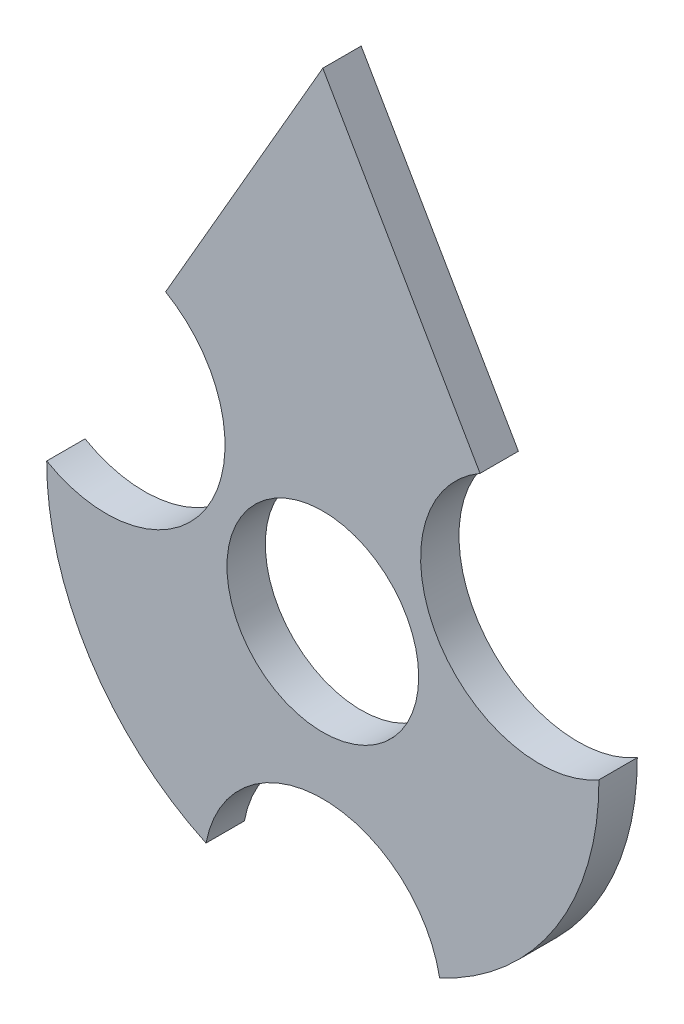
ISO-10303-21;
HEADER;
FILE_DESCRIPTION(('STEP AP214'),'2;1');
FILE_NAME('part.step','',(''),(''),'','','');
FILE_SCHEMA(('AUTOMOTIVE_DESIGN { 1 0 10303 214 1 1 1 1 }'));
ENDSEC;
DATA;
#1=APPLICATION_CONTEXT('core data for automotive mechanical design processes');
#2=APPLICATION_PROTOCOL_DEFINITION('international standard','automotive_design',2000,#1);
#3=PRODUCT_CONTEXT('',#1,'mechanical');
#4=PRODUCT('Part','Part','',(#3));
#5=PRODUCT_RELATED_PRODUCT_CATEGORY('part','',(#4));
#6=PRODUCT_DEFINITION_FORMATION('','',#4);
#7=PRODUCT_DEFINITION_CONTEXT('part definition',#1,'design');
#8=PRODUCT_DEFINITION('design','',#6,#7);
#9=PRODUCT_DEFINITION_SHAPE('','',#8);
#10=(LENGTH_UNIT() NAMED_UNIT(*) SI_UNIT(.MILLI.,.METRE.));
#11=(NAMED_UNIT(*) PLANE_ANGLE_UNIT() SI_UNIT($,.RADIAN.));
#12=(NAMED_UNIT(*) SI_UNIT($,.STERADIAN.) SOLID_ANGLE_UNIT());
#13=UNCERTAINTY_MEASURE_WITH_UNIT(LENGTH_MEASURE(1.E-05),#10,'distance_accuracy_value','');
#14=(GEOMETRIC_REPRESENTATION_CONTEXT(3) GLOBAL_UNCERTAINTY_ASSIGNED_CONTEXT((#13)) GLOBAL_UNIT_ASSIGNED_CONTEXT((#10,
#11,#12)) REPRESENTATION_CONTEXT('',''));
#15=CARTESIAN_POINT('',(0.,0.,0.));
#16=DIRECTION('',(0.,0.,1.));
#17=DIRECTION('',(1.,0.,0.));
#18=AXIS2_PLACEMENT_3D('',#15,#16,#17);
#19=CARTESIAN_POINT('',(-56.5000000000001,27.1391293723585,5.));
#20=DIRECTION('',(0.,0.,-1.));
#21=DIRECTION('',(-1.,0.,0.));
#22=AXIS2_PLACEMENT_3D('',#19,#20,#21);
#23=PLANE('',#22);
#24=DIRECTION('',(-0.500000000000001,-0.866025403784438,0.));
#25=VECTOR('',#24,1.);
#26=CARTESIAN_POINT('',(0.,125.,5.));
#27=LINE('',#26,#25);
#28=CARTESIAN_POINT('',(0.,125.,5.));
#29=VERTEX_POINT('',#28);
#30=CARTESIAN_POINT('',(-41.0000000000001,53.9859168896761,5.));
#31=VERTEX_POINT('',#30);
#32=EDGE_CURVE('E141',#29,#31,#27,.T.);
#33=ORIENTED_EDGE('',*,*,#32,.T.);
#34=CARTESIAN_POINT('',(-56.5000000000001,27.1391293723585,5.));
#35=DIRECTION('',(0.,0.,-1.));
#36=DIRECTION('',(-1.,0.,0.));
#37=AXIS2_PLACEMENT_3D('',#34,#35,#36);
#38=CIRCLE('',#37,31.);
#39=CARTESIAN_POINT('',(-71.9994078864265,0.292000006815876,5.));
#40=VERTEX_POINT('',#39);
#41=EDGE_CURVE('E94',#31,#40,#38,.T.);
#42=ORIENTED_EDGE('',*,*,#41,.T.);
#43=CARTESIAN_POINT('',(0.,0.,5.));
#44=DIRECTION('',(0.,0.,1.));
#45=DIRECTION('',(-1.,0.,0.));
#46=AXIS2_PLACEMENT_3D('',#43,#44,#45);
#47=CIRCLE('',#46,72.);
#48=CARTESIAN_POINT('',(-30.4600707409185,-65.2394366197183,5.));
#49=VERTEX_POINT('',#48);
#50=EDGE_CURVE('E153',#40,#49,#47,.T.);
#51=ORIENTED_EDGE('',*,*,#50,.T.);
#52=CARTESIAN_POINT('',(0.,-71.,5.));
#53=DIRECTION('',(0.,0.,-1.));
#54=DIRECTION('',(1.,0.,0.));
#55=AXIS2_PLACEMENT_3D('',#52,#53,#54);
#56=CIRCLE('',#55,31.);
#57=CARTESIAN_POINT('',(30.4600707409185,-65.2394366197183,5.));
#58=VERTEX_POINT('',#57);
#59=EDGE_CURVE('E110',#49,#58,#56,.T.);
#60=ORIENTED_EDGE('',*,*,#59,.T.);
#61=CARTESIAN_POINT('',(0.,0.,5.));
#62=DIRECTION('',(0.,0.,1.));
#63=DIRECTION('',(1.,0.,0.));
#64=AXIS2_PLACEMENT_3D('',#61,#62,#63);
#65=CIRCLE('',#64,72.);
#66=CARTESIAN_POINT('',(71.9994078864265,0.292000006815851,5.));
#67=VERTEX_POINT('',#66);
#68=EDGE_CURVE('E104',#58,#67,#65,.T.);
#69=ORIENTED_EDGE('',*,*,#68,.T.);
#70=CARTESIAN_POINT('',(56.5000000000001,27.1391293723585,5.));
#71=DIRECTION('',(0.,0.,-1.));
#72=DIRECTION('',(1.,0.,0.));
#73=AXIS2_PLACEMENT_3D('',#70,#71,#72);
#74=CIRCLE('',#73,31.);
#75=CARTESIAN_POINT('',(41.0000000000002,53.9859168896761,5.));
#76=VERTEX_POINT('',#75);
#77=EDGE_CURVE('E108',#67,#76,#74,.T.);
#78=ORIENTED_EDGE('',*,*,#77,.T.);
#79=DIRECTION('',(-0.500000000000002,0.866025403784437,0.));
#80=VECTOR('',#79,1.);
#81=CARTESIAN_POINT('',(0.,125.,5.));
#82=LINE('',#81,#80);
#83=EDGE_CURVE('E54',#76,#29,#82,.T.);
#84=ORIENTED_EDGE('',*,*,#83,.T.);
#85=EDGE_LOOP('',(#33,#42,#51,#60,#69,#78,#84));
#86=FACE_BOUND('',#85,.T.);
#87=CARTESIAN_POINT('',(0.,0.,5.));
#88=DIRECTION('',(0.,0.,1.));
#89=DIRECTION('',(1.,0.,0.));
#90=AXIS2_PLACEMENT_3D('',#87,#88,#89);
#91=CIRCLE('',#90,25.);
#92=CARTESIAN_POINT('',(25.,0.,5.));
#93=VERTEX_POINT('',#92);
#94=EDGE_CURVE('E132',#93,#93,#91,.T.);
#95=ORIENTED_EDGE('',*,*,#94,.F.);
#96=EDGE_LOOP('',(#95));
#97=FACE_BOUND('',#96,.T.);
#98=ADVANCED_FACE('F37',(#86,#97),#23,.F.);
#99=CARTESIAN_POINT('',(-56.5000000000001,27.1391293723585,-5.));
#100=DIRECTION('',(0.,0.,-1.));
#101=DIRECTION('',(-1.,0.,0.));
#102=AXIS2_PLACEMENT_3D('',#99,#100,#101);
#103=PLANE('',#102);
#104=DIRECTION('',(-0.500000000000001,-0.866025403784438,0.));
#105=VECTOR('',#104,1.);
#106=CARTESIAN_POINT('',(0.,125.,-5.));
#107=LINE('',#106,#105);
#108=CARTESIAN_POINT('',(0.,125.,-5.));
#109=VERTEX_POINT('',#108);
#110=CARTESIAN_POINT('',(-41.0000000000001,53.9859168896761,-5.));
#111=VERTEX_POINT('',#110);
#112=EDGE_CURVE('E128',#109,#111,#107,.T.);
#113=ORIENTED_EDGE('',*,*,#112,.F.);
#114=DIRECTION('',(-0.500000000000002,0.866025403784437,0.));
#115=VECTOR('',#114,1.);
#116=CARTESIAN_POINT('',(0.,125.,-5.));
#117=LINE('',#116,#115);
#118=CARTESIAN_POINT('',(41.0000000000002,53.9859168896761,-5.));
#119=VERTEX_POINT('',#118);
#120=EDGE_CURVE('E86',#119,#109,#117,.T.);
#121=ORIENTED_EDGE('',*,*,#120,.F.);
#122=CARTESIAN_POINT('',(56.5000000000001,27.1391293723585,-5.));
#123=DIRECTION('',(0.,0.,-1.));
#124=DIRECTION('',(1.,0.,0.));
#125=AXIS2_PLACEMENT_3D('',#122,#123,#124);
#126=CIRCLE('',#125,31.);
#127=CARTESIAN_POINT('',(71.9994078864265,0.292000006815851,-5.));
#128=VERTEX_POINT('',#127);
#129=EDGE_CURVE('E80',#128,#119,#126,.T.);
#130=ORIENTED_EDGE('',*,*,#129,.F.);
#131=CARTESIAN_POINT('',(0.,0.,-5.));
#132=DIRECTION('',(0.,0.,1.));
#133=DIRECTION('',(1.,0.,0.));
#134=AXIS2_PLACEMENT_3D('',#131,#132,#133);
#135=CIRCLE('',#134,72.);
#136=CARTESIAN_POINT('',(30.4600707409185,-65.2394366197183,-5.));
#137=VERTEX_POINT('',#136);
#138=EDGE_CURVE('E118',#137,#128,#135,.T.);
#139=ORIENTED_EDGE('',*,*,#138,.F.);
#140=CARTESIAN_POINT('',(0.,-71.,-5.));
#141=DIRECTION('',(0.,0.,-1.));
#142=DIRECTION('',(1.,0.,0.));
#143=AXIS2_PLACEMENT_3D('',#140,#141,#142);
#144=CIRCLE('',#143,31.);
#145=CARTESIAN_POINT('',(-30.4600707409185,-65.2394366197183,-5.));
#146=VERTEX_POINT('',#145);
#147=EDGE_CURVE('E136',#146,#137,#144,.T.);
#148=ORIENTED_EDGE('',*,*,#147,.F.);
#149=CARTESIAN_POINT('',(0.,0.,-5.));
#150=DIRECTION('',(0.,0.,1.));
#151=DIRECTION('',(-1.,0.,0.));
#152=AXIS2_PLACEMENT_3D('',#149,#150,#151);
#153=CIRCLE('',#152,72.);
#154=CARTESIAN_POINT('',(-71.9994078864265,0.292000006815876,-5.));
#155=VERTEX_POINT('',#154);
#156=EDGE_CURVE('E134',#155,#146,#153,.T.);
#157=ORIENTED_EDGE('',*,*,#156,.F.);
#158=CARTESIAN_POINT('',(-56.5000000000001,27.1391293723585,-5.));
#159=DIRECTION('',(0.,0.,-1.));
#160=DIRECTION('',(-1.,0.,0.));
#161=AXIS2_PLACEMENT_3D('',#158,#159,#160);
#162=CIRCLE('',#161,31.);
#163=EDGE_CURVE('E131',#111,#155,#162,.T.);
#164=ORIENTED_EDGE('',*,*,#163,.F.);
#165=EDGE_LOOP('',(#113,#121,#130,#139,#148,#157,#164));
#166=FACE_BOUND('',#165,.T.);
#167=CARTESIAN_POINT('',(0.,0.,-5.));
#168=DIRECTION('',(0.,0.,1.));
#169=DIRECTION('',(1.,0.,0.));
#170=AXIS2_PLACEMENT_3D('',#167,#168,#169);
#171=CIRCLE('',#170,25.);
#172=CARTESIAN_POINT('',(25.,0.,-5.));
#173=VERTEX_POINT('',#172);
#174=EDGE_CURVE('E165',#173,#173,#171,.T.);
#175=ORIENTED_EDGE('',*,*,#174,.T.);
#176=EDGE_LOOP('',(#175));
#177=FACE_BOUND('',#176,.T.);
#178=ADVANCED_FACE('F157',(#166,#177),#103,.T.);
#179=CARTESIAN_POINT('',(0.,125.,5.));
#180=DIRECTION('',(0.866025403784438,-0.500000000000001,0.));
#181=DIRECTION('',(0.500000000000001,0.866025403784438,0.));
#182=AXIS2_PLACEMENT_3D('',#179,#180,#181);
#183=PLANE('',#182);
#184=ORIENTED_EDGE('',*,*,#112,.T.);
#185=DIRECTION('',(0.,0.,-1.));
#186=VECTOR('',#185,1.);
#187=CARTESIAN_POINT('',(-41.0000000000001,53.9859168896761,5.));
#188=LINE('',#187,#186);
#189=EDGE_CURVE('E11',#31,#111,#188,.T.);
#190=ORIENTED_EDGE('',*,*,#189,.F.);
#191=ORIENTED_EDGE('',*,*,#32,.F.);
#192=DIRECTION('',(0.,0.,-1.));
#193=VECTOR('',#192,1.);
#194=CARTESIAN_POINT('',(0.,125.,5.));
#195=LINE('',#194,#193);
#196=EDGE_CURVE('E124',#29,#109,#195,.T.);
#197=ORIENTED_EDGE('',*,*,#196,.T.);
#198=EDGE_LOOP('',(#184,#190,#191,#197));
#199=FACE_BOUND('',#198,.T.);
#200=ADVANCED_FACE('F39',(#199),#183,.F.);
#201=CARTESIAN_POINT('',(-56.5000000000001,27.1391293723585,5.));
#202=DIRECTION('',(0.,0.,-1.));
#203=DIRECTION('',(-1.,0.,0.));
#204=AXIS2_PLACEMENT_3D('',#201,#202,#203);
#205=CYLINDRICAL_SURFACE('',#204,31.);
#206=ORIENTED_EDGE('',*,*,#163,.T.);
#207=DIRECTION('',(0.,0.,-1.));
#208=VECTOR('',#207,1.);
#209=CARTESIAN_POINT('',(-71.9994078864265,0.292000006815876,5.));
#210=LINE('',#209,#208);
#211=EDGE_CURVE('E46',#40,#155,#210,.T.);
#212=ORIENTED_EDGE('',*,*,#211,.F.);
#213=ORIENTED_EDGE('',*,*,#41,.F.);
#214=ORIENTED_EDGE('',*,*,#189,.T.);
#215=EDGE_LOOP('',(#206,#212,#213,#214));
#216=FACE_BOUND('',#215,.T.);
#217=ADVANCED_FACE('F191',(#216),#205,.F.);
#218=CARTESIAN_POINT('',(0.,0.,5.));
#219=DIRECTION('',(0.,0.,-1.));
#220=DIRECTION('',(-1.,0.,0.));
#221=AXIS2_PLACEMENT_3D('',#218,#219,#220);
#222=CYLINDRICAL_SURFACE('',#221,72.);
#223=ORIENTED_EDGE('',*,*,#156,.T.);
#224=DIRECTION('',(0.,0.,-1.));
#225=VECTOR('',#224,1.);
#226=CARTESIAN_POINT('',(-30.4600707409185,-65.2394366197183,5.));
#227=LINE('',#226,#225);
#228=EDGE_CURVE('E145',#49,#146,#227,.T.);
#229=ORIENTED_EDGE('',*,*,#228,.F.);
#230=ORIENTED_EDGE('',*,*,#50,.F.);
#231=ORIENTED_EDGE('',*,*,#211,.T.);
#232=EDGE_LOOP('',(#223,#229,#230,#231));
#233=FACE_BOUND('',#232,.T.);
#234=ADVANCED_FACE('F151',(#233),#222,.T.);
#235=CARTESIAN_POINT('',(0.,-71.,5.));
#236=DIRECTION('',(0.,0.,-1.));
#237=DIRECTION('',(-1.,0.,0.));
#238=AXIS2_PLACEMENT_3D('',#235,#236,#237);
#239=CYLINDRICAL_SURFACE('',#238,31.);
#240=ORIENTED_EDGE('',*,*,#147,.T.);
#241=DIRECTION('',(0.,0.,-1.));
#242=VECTOR('',#241,1.);
#243=CARTESIAN_POINT('',(30.4600707409185,-65.2394366197183,5.));
#244=LINE('',#243,#242);
#245=EDGE_CURVE('E119',#58,#137,#244,.T.);
#246=ORIENTED_EDGE('',*,*,#245,.F.);
#247=ORIENTED_EDGE('',*,*,#59,.F.);
#248=ORIENTED_EDGE('',*,*,#228,.T.);
#249=EDGE_LOOP('',(#240,#246,#247,#248));
#250=FACE_BOUND('',#249,.T.);
#251=ADVANCED_FACE('F160',(#250),#239,.F.);
#252=CARTESIAN_POINT('',(0.,0.,5.));
#253=DIRECTION('',(0.,0.,-1.));
#254=DIRECTION('',(-1.,0.,0.));
#255=AXIS2_PLACEMENT_3D('',#252,#253,#254);
#256=CYLINDRICAL_SURFACE('',#255,72.);
#257=ORIENTED_EDGE('',*,*,#138,.T.);
#258=DIRECTION('',(0.,0.,-1.));
#259=VECTOR('',#258,1.);
#260=CARTESIAN_POINT('',(71.9994078864265,0.292000006815851,5.));
#261=LINE('',#260,#259);
#262=EDGE_CURVE('E115',#67,#128,#261,.T.);
#263=ORIENTED_EDGE('',*,*,#262,.F.);
#264=ORIENTED_EDGE('',*,*,#68,.F.);
#265=ORIENTED_EDGE('',*,*,#245,.T.);
#266=EDGE_LOOP('',(#257,#263,#264,#265));
#267=FACE_BOUND('',#266,.T.);
#268=ADVANCED_FACE('F116',(#267),#256,.T.);
#269=CARTESIAN_POINT('',(56.5000000000001,27.1391293723585,5.));
#270=DIRECTION('',(0.,0.,-1.));
#271=DIRECTION('',(-1.,0.,0.));
#272=AXIS2_PLACEMENT_3D('',#269,#270,#271);
#273=CYLINDRICAL_SURFACE('',#272,31.);
#274=ORIENTED_EDGE('',*,*,#129,.T.);
#275=DIRECTION('',(0.,0.,-1.));
#276=VECTOR('',#275,1.);
#277=CARTESIAN_POINT('',(41.0000000000002,53.9859168896761,5.));
#278=LINE('',#277,#276);
#279=EDGE_CURVE('E120',#76,#119,#278,.T.);
#280=ORIENTED_EDGE('',*,*,#279,.F.);
#281=ORIENTED_EDGE('',*,*,#77,.F.);
#282=ORIENTED_EDGE('',*,*,#262,.T.);
#283=EDGE_LOOP('',(#274,#280,#281,#282));
#284=FACE_BOUND('',#283,.T.);
#285=ADVANCED_FACE('F122',(#284),#273,.F.);
#286=CARTESIAN_POINT('',(0.,125.,5.));
#287=DIRECTION('',(-0.866025403784437,-0.500000000000002,0.));
#288=DIRECTION('',(0.500000000000002,-0.866025403784437,0.));
#289=AXIS2_PLACEMENT_3D('',#286,#287,#288);
#290=PLANE('',#289);
#291=ORIENTED_EDGE('',*,*,#120,.T.);
#292=ORIENTED_EDGE('',*,*,#196,.F.);
#293=ORIENTED_EDGE('',*,*,#83,.F.);
#294=ORIENTED_EDGE('',*,*,#279,.T.);
#295=EDGE_LOOP('',(#291,#292,#293,#294));
#296=FACE_BOUND('',#295,.T.);
#297=ADVANCED_FACE('F181',(#296),#290,.F.);
#298=CARTESIAN_POINT('',(0.,0.,5.));
#299=DIRECTION('',(0.,0.,-1.));
#300=DIRECTION('',(-1.,0.,0.));
#301=AXIS2_PLACEMENT_3D('',#298,#299,#300);
#302=CYLINDRICAL_SURFACE('',#301,25.);
#303=ORIENTED_EDGE('',*,*,#94,.T.);
#304=EDGE_LOOP('',(#303));
#305=FACE_BOUND('',#304,.T.);
#306=ORIENTED_EDGE('',*,*,#174,.F.);
#307=EDGE_LOOP('',(#306));
#308=FACE_BOUND('',#307,.T.);
#309=ADVANCED_FACE('F171',(#305,#308),#302,.F.);
#310=CLOSED_SHELL('',(#98,#178,#200,#217,#234,#251,#268,#285,#297,#309));
#311=MANIFOLD_SOLID_BREP('B2',#310);
#312=ADVANCED_BREP_SHAPE_REPRESENTATION('',(#18,#311),#14);
#313=SHAPE_DEFINITION_REPRESENTATION(#9,#312);
ENDSEC;
END-ISO-10303-21;
